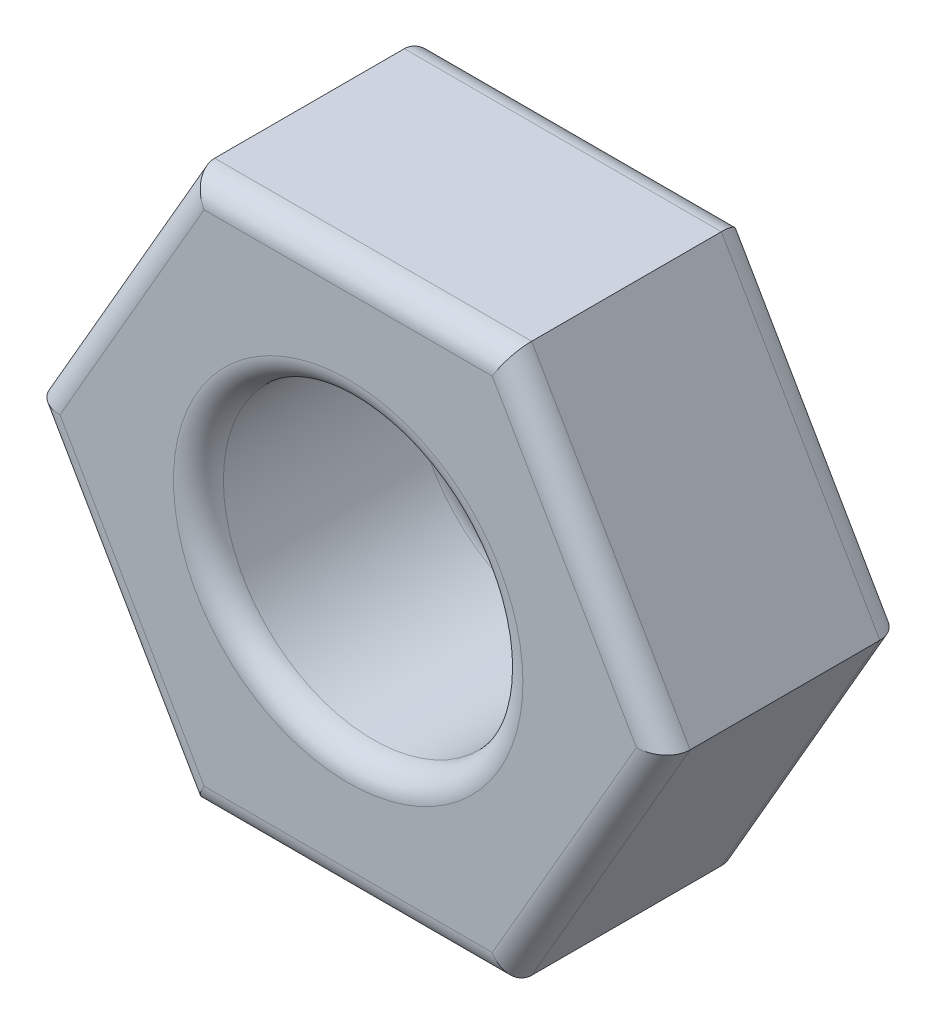
ISO-10303-21;
HEADER;
FILE_DESCRIPTION(('STEP AP214'),'2;1');
FILE_NAME('part.step','',(''),(''),'','','');
FILE_SCHEMA(('AUTOMOTIVE_DESIGN { 1 0 10303 214 1 1 1 1 }'));
ENDSEC;
DATA;
#1=APPLICATION_CONTEXT('core data for automotive mechanical design processes');
#2=APPLICATION_PROTOCOL_DEFINITION('international standard','automotive_design',2000,#1);
#3=PRODUCT_CONTEXT('',#1,'mechanical');
#4=PRODUCT('Part','Part','',(#3));
#5=PRODUCT_RELATED_PRODUCT_CATEGORY('part','',(#4));
#6=PRODUCT_DEFINITION_FORMATION('','',#4);
#7=PRODUCT_DEFINITION_CONTEXT('part definition',#1,'design');
#8=PRODUCT_DEFINITION('design','',#6,#7);
#9=PRODUCT_DEFINITION_SHAPE('','',#8);
#10=(LENGTH_UNIT() NAMED_UNIT(*) SI_UNIT(.MILLI.,.METRE.));
#11=(NAMED_UNIT(*) PLANE_ANGLE_UNIT() SI_UNIT($,.RADIAN.));
#12=(NAMED_UNIT(*) SI_UNIT($,.STERADIAN.) SOLID_ANGLE_UNIT());
#13=UNCERTAINTY_MEASURE_WITH_UNIT(LENGTH_MEASURE(1.E-05),#10,'distance_accuracy_value','');
#14=(GEOMETRIC_REPRESENTATION_CONTEXT(3) GLOBAL_UNCERTAINTY_ASSIGNED_CONTEXT((#13)) GLOBAL_UNIT_ASSIGNED_CONTEXT((#10,
#11,#12)) REPRESENTATION_CONTEXT('',''));
#15=CARTESIAN_POINT('',(0.,0.,0.));
#16=DIRECTION('',(0.,0.,1.));
#17=DIRECTION('',(1.,0.,0.));
#18=AXIS2_PLACEMENT_3D('',#15,#16,#17);
#19=CARTESIAN_POINT('',(0.,0.,2.4));
#20=DIRECTION('',(0.,0.,1.));
#21=DIRECTION('',(1.,0.,0.));
#22=AXIS2_PLACEMENT_3D('',#19,#20,#21);
#23=PLANE('',#22);
#24=CARTESIAN_POINT('',(0.,0.,2.4));
#25=DIRECTION('',(0.,0.,1.));
#26=DIRECTION('',(1.,0.,0.));
#27=AXIS2_PLACEMENT_3D('',#24,#25,#26);
#28=CIRCLE('',#27,1.75);
#29=CARTESIAN_POINT('',(1.75,0.,2.4));
#30=VERTEX_POINT('',#29);
#31=EDGE_CURVE('E11',#30,#30,#28,.F.);
#32=ORIENTED_EDGE('',*,*,#31,.T.);
#33=EDGE_LOOP('',(#32));
#34=FACE_BOUND('',#33,.T.);
#35=DIRECTION('',(1.,0.,0.));
#36=VECTOR('',#35,1.);
#37=CARTESIAN_POINT('',(1.58771324027147,-2.5,2.4));
#38=LINE('',#37,#36);
#39=CARTESIAN_POINT('',(-1.44337567297407,-2.5,2.4));
#40=VERTEX_POINT('',#39);
#41=CARTESIAN_POINT('',(1.44337567297406,-2.5,2.4));
#42=VERTEX_POINT('',#41);
#43=EDGE_CURVE('E58',#40,#42,#38,.T.);
#44=ORIENTED_EDGE('',*,*,#43,.T.);
#45=DIRECTION('',(0.5,0.866025403784439,0.));
#46=VECTOR('',#45,1.);
#47=CARTESIAN_POINT('',(2.95892012959683,0.125000000000001,2.4));
#48=LINE('',#47,#46);
#49=CARTESIAN_POINT('',(2.88675134594813,0.,2.4));
#50=VERTEX_POINT('',#49);
#51=EDGE_CURVE('E50',#42,#50,#48,.T.);
#52=ORIENTED_EDGE('',*,*,#51,.T.);
#53=DIRECTION('',(-0.5,0.866025403784439,0.));
#54=VECTOR('',#53,1.);
#55=CARTESIAN_POINT('',(1.37120688932536,2.625,2.4));
#56=LINE('',#55,#54);
#57=CARTESIAN_POINT('',(1.44337567297407,2.5,2.4));
#58=VERTEX_POINT('',#57);
#59=EDGE_CURVE('E197',#50,#58,#56,.T.);
#60=ORIENTED_EDGE('',*,*,#59,.T.);
#61=DIRECTION('',(-1.,0.,0.));
#62=VECTOR('',#61,1.);
#63=CARTESIAN_POINT('',(-1.58771324027147,2.5,2.4));
#64=LINE('',#63,#62);
#65=CARTESIAN_POINT('',(-1.44337567297406,2.5,2.4));
#66=VERTEX_POINT('',#65);
#67=EDGE_CURVE('E199',#58,#66,#64,.T.);
#68=ORIENTED_EDGE('',*,*,#67,.T.);
#69=DIRECTION('',(-0.5,-0.866025403784439,0.));
#70=VECTOR('',#69,1.);
#71=CARTESIAN_POINT('',(-2.95892012959683,-0.124999999999999,2.4));
#72=LINE('',#71,#70);
#73=CARTESIAN_POINT('',(-2.88675134594813,0.,2.4));
#74=VERTEX_POINT('',#73);
#75=EDGE_CURVE('E201',#66,#74,#72,.T.);
#76=ORIENTED_EDGE('',*,*,#75,.T.);
#77=DIRECTION('',(0.5,-0.866025403784439,0.));
#78=VECTOR('',#77,1.);
#79=CARTESIAN_POINT('',(-1.37120688932536,-2.625,2.4));
#80=LINE('',#79,#78);
#81=EDGE_CURVE('E63',#74,#40,#80,.T.);
#82=ORIENTED_EDGE('',*,*,#81,.T.);
#83=EDGE_LOOP('',(#44,#52,#60,#68,#76,#82));
#84=FACE_BOUND('',#83,.T.);
#85=ADVANCED_FACE('F41',(#34,#84),#23,.T.);
#86=CARTESIAN_POINT('',(0.,0.,0.));
#87=DIRECTION('',(0.,0.,1.));
#88=DIRECTION('',(1.,0.,0.));
#89=AXIS2_PLACEMENT_3D('',#86,#87,#88);
#90=PLANE('',#89);
#91=CARTESIAN_POINT('',(0.,0.,0.));
#92=DIRECTION('',(0.,0.,1.));
#93=DIRECTION('',(1.,0.,0.));
#94=AXIS2_PLACEMENT_3D('',#91,#92,#93);
#95=CIRCLE('',#94,1.75);
#96=CARTESIAN_POINT('',(1.75,0.,0.));
#97=VERTEX_POINT('',#96);
#98=EDGE_CURVE('E159',#97,#97,#95,.T.);
#99=ORIENTED_EDGE('',*,*,#98,.T.);
#100=EDGE_LOOP('',(#99));
#101=FACE_BOUND('',#100,.T.);
#102=DIRECTION('',(-0.5,-0.866025403784439,0.));
#103=VECTOR('',#102,1.);
#104=CARTESIAN_POINT('',(-2.1650635094611,1.25,0.));
#105=LINE('',#104,#103);
#106=CARTESIAN_POINT('',(-2.88675134594813,0.,0.));
#107=VERTEX_POINT('',#106);
#108=CARTESIAN_POINT('',(-1.44337567297406,2.5,0.));
#109=VERTEX_POINT('',#108);
#110=EDGE_CURVE('E158',#107,#109,#105,.F.);
#111=ORIENTED_EDGE('',*,*,#110,.T.);
#112=DIRECTION('',(-1.,0.,0.));
#113=VECTOR('',#112,1.);
#114=CARTESIAN_POINT('',(0.,2.5,0.));
#115=LINE('',#114,#113);
#116=CARTESIAN_POINT('',(1.44337567297406,2.5,0.));
#117=VERTEX_POINT('',#116);
#118=EDGE_CURVE('E137',#109,#117,#115,.F.);
#119=ORIENTED_EDGE('',*,*,#118,.T.);
#120=DIRECTION('',(-0.5,0.866025403784439,0.));
#121=VECTOR('',#120,1.);
#122=CARTESIAN_POINT('',(2.1650635094611,1.25,0.));
#123=LINE('',#122,#121);
#124=CARTESIAN_POINT('',(2.88675134594813,0.,0.));
#125=VERTEX_POINT('',#124);
#126=EDGE_CURVE('E147',#117,#125,#123,.F.);
#127=ORIENTED_EDGE('',*,*,#126,.T.);
#128=DIRECTION('',(0.5,0.866025403784439,0.));
#129=VECTOR('',#128,1.);
#130=CARTESIAN_POINT('',(2.1650635094611,-1.25,0.));
#131=LINE('',#130,#129);
#132=CARTESIAN_POINT('',(1.44337567297406,-2.5,0.));
#133=VERTEX_POINT('',#132);
#134=EDGE_CURVE('E153',#125,#133,#131,.F.);
#135=ORIENTED_EDGE('',*,*,#134,.T.);
#136=DIRECTION('',(1.,0.,0.));
#137=VECTOR('',#136,1.);
#138=CARTESIAN_POINT('',(0.,-2.5,0.));
#139=LINE('',#138,#137);
#140=CARTESIAN_POINT('',(-1.44337567297407,-2.5,0.));
#141=VERTEX_POINT('',#140);
#142=EDGE_CURVE('E259',#133,#141,#139,.F.);
#143=ORIENTED_EDGE('',*,*,#142,.T.);
#144=DIRECTION('',(0.5,-0.866025403784439,0.));
#145=VECTOR('',#144,1.);
#146=CARTESIAN_POINT('',(-2.1650635094611,-1.25,0.));
#147=LINE('',#146,#145);
#148=EDGE_CURVE('E164',#141,#107,#147,.F.);
#149=ORIENTED_EDGE('',*,*,#148,.T.);
#150=EDGE_LOOP('',(#111,#119,#127,#135,#143,#149));
#151=FACE_BOUND('',#150,.T.);
#152=ADVANCED_FACE('F156',(#101,#151),#90,.F.);
#153=CARTESIAN_POINT('',(3.17542648054294,0.,2.4));
#154=DIRECTION('',(-0.866025403784439,-0.5,0.));
#155=DIRECTION('',(0.5,-0.866025403784439,0.));
#156=AXIS2_PLACEMENT_3D('',#153,#154,#155);
#157=PLANE('',#156);
#158=DIRECTION('',(0.,0.,-1.));
#159=VECTOR('',#158,1.);
#160=CARTESIAN_POINT('',(3.17542648054294,0.,2.4));
#161=LINE('',#160,#159);
#162=CARTESIAN_POINT('',(3.17542648054294,0.,2.15));
#163=VERTEX_POINT('',#162);
#164=CARTESIAN_POINT('',(3.17542648054294,0.,0.25));
#165=VERTEX_POINT('',#164);
#166=EDGE_CURVE('E216',#163,#165,#161,.T.);
#167=ORIENTED_EDGE('',*,*,#166,.T.);
#168=DIRECTION('',(-0.5,0.866025403784439,0.));
#169=VECTOR('',#168,1.);
#170=CARTESIAN_POINT('',(3.17542648054294,0.,0.25));
#171=LINE('',#170,#169);
#172=CARTESIAN_POINT('',(1.58771324027147,2.75,0.25));
#173=VERTEX_POINT('',#172);
#174=EDGE_CURVE('E195',#165,#173,#171,.T.);
#175=ORIENTED_EDGE('',*,*,#174,.T.);
#176=DIRECTION('',(0.,0.,-1.));
#177=VECTOR('',#176,1.);
#178=CARTESIAN_POINT('',(1.58771324027147,2.75,2.4));
#179=LINE('',#178,#177);
#180=CARTESIAN_POINT('',(1.58771324027147,2.75,2.15));
#181=VERTEX_POINT('',#180);
#182=EDGE_CURVE('E154',#181,#173,#179,.T.);
#183=ORIENTED_EDGE('',*,*,#182,.F.);
#184=DIRECTION('',(-0.5,0.866025403784439,0.));
#185=VECTOR('',#184,1.);
#186=CARTESIAN_POINT('',(3.17542648054294,0.,2.15));
#187=LINE('',#186,#185);
#188=EDGE_CURVE('E193',#181,#163,#187,.F.);
#189=ORIENTED_EDGE('',*,*,#188,.T.);
#190=EDGE_LOOP('',(#167,#175,#183,#189));
#191=FACE_BOUND('',#190,.T.);
#192=ADVANCED_FACE('F283',(#191),#157,.F.);
#193=CARTESIAN_POINT('',(1.58771324027147,2.75,2.4));
#194=DIRECTION('',(0.,-1.,0.));
#195=DIRECTION('',(0.,0.,-1.));
#196=AXIS2_PLACEMENT_3D('',#193,#194,#195);
#197=PLANE('',#196);
#198=ORIENTED_EDGE('',*,*,#182,.T.);
#199=DIRECTION('',(-1.,0.,0.));
#200=VECTOR('',#199,1.);
#201=CARTESIAN_POINT('',(1.58771324027147,2.75,0.25));
#202=LINE('',#201,#200);
#203=CARTESIAN_POINT('',(-1.58771324027147,2.75,0.25));
#204=VERTEX_POINT('',#203);
#205=EDGE_CURVE('E140',#173,#204,#202,.T.);
#206=ORIENTED_EDGE('',*,*,#205,.T.);
#207=DIRECTION('',(0.,0.,-1.));
#208=VECTOR('',#207,1.);
#209=CARTESIAN_POINT('',(-1.58771324027147,2.75,2.4));
#210=LINE('',#209,#208);
#211=CARTESIAN_POINT('',(-1.58771324027147,2.75,2.15));
#212=VERTEX_POINT('',#211);
#213=EDGE_CURVE('E245',#212,#204,#210,.T.);
#214=ORIENTED_EDGE('',*,*,#213,.F.);
#215=DIRECTION('',(-1.,0.,0.));
#216=VECTOR('',#215,1.);
#217=CARTESIAN_POINT('',(1.58771324027147,2.75,2.15));
#218=LINE('',#217,#216);
#219=EDGE_CURVE('E173',#212,#181,#218,.F.);
#220=ORIENTED_EDGE('',*,*,#219,.T.);
#221=EDGE_LOOP('',(#198,#206,#214,#220));
#222=FACE_BOUND('',#221,.T.);
#223=ADVANCED_FACE('F250',(#222),#197,.F.);
#224=CARTESIAN_POINT('',(-1.58771324027147,2.75,2.4));
#225=DIRECTION('',(0.866025403784439,-0.5,0.));
#226=DIRECTION('',(0.5,0.866025403784439,0.));
#227=AXIS2_PLACEMENT_3D('',#224,#225,#226);
#228=PLANE('',#227);
#229=ORIENTED_EDGE('',*,*,#213,.T.);
#230=DIRECTION('',(-0.5,-0.866025403784439,0.));
#231=VECTOR('',#230,1.);
#232=CARTESIAN_POINT('',(-1.58771324027147,2.75,0.25));
#233=LINE('',#232,#231);
#234=CARTESIAN_POINT('',(-3.17542648054294,0.,0.25));
#235=VERTEX_POINT('',#234);
#236=EDGE_CURVE('E178',#204,#235,#233,.T.);
#237=ORIENTED_EDGE('',*,*,#236,.T.);
#238=DIRECTION('',(0.,0.,-1.));
#239=VECTOR('',#238,1.);
#240=CARTESIAN_POINT('',(-3.17542648054294,0.,2.4));
#241=LINE('',#240,#239);
#242=CARTESIAN_POINT('',(-3.17542648054294,0.,2.15));
#243=VERTEX_POINT('',#242);
#244=EDGE_CURVE('E247',#243,#235,#241,.T.);
#245=ORIENTED_EDGE('',*,*,#244,.F.);
#246=DIRECTION('',(-0.5,-0.866025403784439,0.));
#247=VECTOR('',#246,1.);
#248=CARTESIAN_POINT('',(-1.58771324027147,2.75,2.15));
#249=LINE('',#248,#247);
#250=EDGE_CURVE('E176',#243,#212,#249,.F.);
#251=ORIENTED_EDGE('',*,*,#250,.T.);
#252=EDGE_LOOP('',(#229,#237,#245,#251));
#253=FACE_BOUND('',#252,.T.);
#254=ADVANCED_FACE('F244',(#253),#228,.F.);
#255=CARTESIAN_POINT('',(-3.17542648054294,0.,2.4));
#256=DIRECTION('',(0.866025403784439,0.5,0.));
#257=DIRECTION('',(-0.5,0.866025403784439,0.));
#258=AXIS2_PLACEMENT_3D('',#255,#256,#257);
#259=PLANE('',#258);
#260=ORIENTED_EDGE('',*,*,#244,.T.);
#261=DIRECTION('',(0.5,-0.866025403784439,0.));
#262=VECTOR('',#261,1.);
#263=CARTESIAN_POINT('',(-3.17542648054294,0.,0.25));
#264=LINE('',#263,#262);
#265=CARTESIAN_POINT('',(-1.58771324027147,-2.75,0.25));
#266=VERTEX_POINT('',#265);
#267=EDGE_CURVE('E182',#235,#266,#264,.T.);
#268=ORIENTED_EDGE('',*,*,#267,.T.);
#269=DIRECTION('',(0.,0.,-1.));
#270=VECTOR('',#269,1.);
#271=CARTESIAN_POINT('',(-1.58771324027147,-2.75,2.4));
#272=LINE('',#271,#270);
#273=CARTESIAN_POINT('',(-1.58771324027147,-2.75,2.15));
#274=VERTEX_POINT('',#273);
#275=EDGE_CURVE('E254',#274,#266,#272,.T.);
#276=ORIENTED_EDGE('',*,*,#275,.F.);
#277=DIRECTION('',(0.5,-0.866025403784439,0.));
#278=VECTOR('',#277,1.);
#279=CARTESIAN_POINT('',(-3.17542648054294,0.,2.15));
#280=LINE('',#279,#278);
#281=EDGE_CURVE('E180',#274,#243,#280,.F.);
#282=ORIENTED_EDGE('',*,*,#281,.T.);
#283=EDGE_LOOP('',(#260,#268,#276,#282));
#284=FACE_BOUND('',#283,.T.);
#285=ADVANCED_FACE('F271',(#284),#259,.F.);
#286=CARTESIAN_POINT('',(-1.58771324027147,-2.75,2.4));
#287=DIRECTION('',(0.,1.,0.));
#288=DIRECTION('',(-1.,0.,0.));
#289=AXIS2_PLACEMENT_3D('',#286,#287,#288);
#290=PLANE('',#289);
#291=ORIENTED_EDGE('',*,*,#275,.T.);
#292=DIRECTION('',(1.,0.,0.));
#293=VECTOR('',#292,1.);
#294=CARTESIAN_POINT('',(-1.58771324027147,-2.75,0.25));
#295=LINE('',#294,#293);
#296=CARTESIAN_POINT('',(1.58771324027147,-2.75,0.25));
#297=VERTEX_POINT('',#296);
#298=EDGE_CURVE('E186',#266,#297,#295,.T.);
#299=ORIENTED_EDGE('',*,*,#298,.T.);
#300=DIRECTION('',(0.,0.,-1.));
#301=VECTOR('',#300,1.);
#302=CARTESIAN_POINT('',(1.58771324027147,-2.75,2.4));
#303=LINE('',#302,#301);
#304=CARTESIAN_POINT('',(1.58771324027147,-2.75,2.15));
#305=VERTEX_POINT('',#304);
#306=EDGE_CURVE('E276',#305,#297,#303,.T.);
#307=ORIENTED_EDGE('',*,*,#306,.F.);
#308=DIRECTION('',(1.,0.,0.));
#309=VECTOR('',#308,1.);
#310=CARTESIAN_POINT('',(-1.58771324027147,-2.75,2.15));
#311=LINE('',#310,#309);
#312=EDGE_CURVE('E184',#305,#274,#311,.F.);
#313=ORIENTED_EDGE('',*,*,#312,.T.);
#314=EDGE_LOOP('',(#291,#299,#307,#313));
#315=FACE_BOUND('',#314,.T.);
#316=ADVANCED_FACE('F294',(#315),#290,.F.);
#317=CARTESIAN_POINT('',(1.58771324027147,-2.75,2.4));
#318=DIRECTION('',(-0.866025403784438,0.5,0.));
#319=DIRECTION('',(-0.5,-0.866025403784439,0.));
#320=AXIS2_PLACEMENT_3D('',#317,#318,#319);
#321=PLANE('',#320);
#322=ORIENTED_EDGE('',*,*,#306,.T.);
#323=DIRECTION('',(0.5,0.866025403784439,0.));
#324=VECTOR('',#323,1.);
#325=CARTESIAN_POINT('',(1.58771324027147,-2.75,0.25));
#326=LINE('',#325,#324);
#327=EDGE_CURVE('E191',#297,#165,#326,.T.);
#328=ORIENTED_EDGE('',*,*,#327,.T.);
#329=ORIENTED_EDGE('',*,*,#166,.F.);
#330=DIRECTION('',(0.5,0.866025403784439,0.));
#331=VECTOR('',#330,1.);
#332=CARTESIAN_POINT('',(1.58771324027147,-2.75,2.15));
#333=LINE('',#332,#331);
#334=EDGE_CURVE('E188',#163,#305,#333,.F.);
#335=ORIENTED_EDGE('',*,*,#334,.T.);
#336=EDGE_LOOP('',(#322,#328,#329,#335));
#337=FACE_BOUND('',#336,.T.);
#338=ADVANCED_FACE('F295',(#337),#321,.F.);
#339=CARTESIAN_POINT('',(0.,0.,2.4));
#340=DIRECTION('',(0.,0.,-1.));
#341=DIRECTION('',(-1.,0.,0.));
#342=AXIS2_PLACEMENT_3D('',#339,#340,#341);
#343=CYLINDRICAL_SURFACE('',#342,1.5);
#344=CARTESIAN_POINT('',(0.,0.,0.25));
#345=DIRECTION('',(0.,0.,1.));
#346=DIRECTION('',(1.,0.,0.));
#347=AXIS2_PLACEMENT_3D('',#344,#345,#346);
#348=CIRCLE('',#347,1.5);
#349=CARTESIAN_POINT('',(1.5,0.,0.25));
#350=VERTEX_POINT('',#349);
#351=EDGE_CURVE('E170',#350,#350,#348,.F.);
#352=ORIENTED_EDGE('',*,*,#351,.T.);
#353=EDGE_LOOP('',(#352));
#354=FACE_BOUND('',#353,.T.);
#355=CARTESIAN_POINT('',(0.,0.,2.15));
#356=DIRECTION('',(0.,0.,1.));
#357=DIRECTION('',(1.,0.,0.));
#358=AXIS2_PLACEMENT_3D('',#355,#356,#357);
#359=CIRCLE('',#358,1.5);
#360=CARTESIAN_POINT('',(1.5,0.,2.15));
#361=VERTEX_POINT('',#360);
#362=EDGE_CURVE('E162',#361,#361,#359,.T.);
#363=ORIENTED_EDGE('',*,*,#362,.T.);
#364=EDGE_LOOP('',(#363));
#365=FACE_BOUND('',#364,.T.);
#366=ADVANCED_FACE('F314',(#354,#365),#343,.F.);
#367=CARTESIAN_POINT('',(0.,0.,0.25));
#368=DIRECTION('',(0.,0.,1.));
#369=DIRECTION('',(1.,0.,0.));
#370=AXIS2_PLACEMENT_3D('',#367,#368,#369);
#371=TOROIDAL_SURFACE('',#370,1.75,0.25);
#372=ORIENTED_EDGE('',*,*,#351,.F.);
#373=EDGE_LOOP('',(#372));
#374=FACE_BOUND('',#373,.T.);
#375=ORIENTED_EDGE('',*,*,#98,.F.);
#376=EDGE_LOOP('',(#375));
#377=FACE_BOUND('',#376,.T.);
#378=ADVANCED_FACE('F328',(#374,#377),#371,.T.);
#379=CARTESIAN_POINT('',(-1.58771324027147,-2.5,0.25));
#380=DIRECTION('',(1.,0.,0.));
#381=DIRECTION('',(0.,1.,0.));
#382=AXIS2_PLACEMENT_3D('',#379,#380,#381);
#383=CYLINDRICAL_SURFACE('',#382,0.25);
#384=CARTESIAN_POINT('',(-1.44337567297407,-2.5,0.25));
#385=DIRECTION('',(0.866025403784439,-0.5,0.));
#386=DIRECTION('',(0.5,0.866025403784439,0.));
#387=AXIS2_PLACEMENT_3D('',#384,#385,#386);
#388=ELLIPSE('',#387,0.288675134594813,0.25);
#389=EDGE_CURVE('E210',#141,#266,#388,.F.);
#390=ORIENTED_EDGE('',*,*,#389,.F.);
#391=ORIENTED_EDGE('',*,*,#142,.F.);
#392=CARTESIAN_POINT('',(1.44337567297406,-2.5,0.25));
#393=DIRECTION('',(0.866025403784439,0.5,0.));
#394=DIRECTION('',(-0.5,0.866025403784439,0.));
#395=AXIS2_PLACEMENT_3D('',#392,#393,#394);
#396=ELLIPSE('',#395,0.288675134594813,0.25);
#397=EDGE_CURVE('E213',#297,#133,#396,.T.);
#398=ORIENTED_EDGE('',*,*,#397,.F.);
#399=ORIENTED_EDGE('',*,*,#298,.F.);
#400=EDGE_LOOP('',(#390,#391,#398,#399));
#401=FACE_BOUND('',#400,.T.);
#402=ADVANCED_FACE('F292',(#401),#383,.T.);
#403=CARTESIAN_POINT('',(1.37120688932536,-2.625,0.25));
#404=DIRECTION('',(0.5,0.866025403784439,0.));
#405=DIRECTION('',(-0.866025403784439,0.5,0.));
#406=AXIS2_PLACEMENT_3D('',#403,#404,#405);
#407=CYLINDRICAL_SURFACE('',#406,0.25);
#408=ORIENTED_EDGE('',*,*,#397,.T.);
#409=ORIENTED_EDGE('',*,*,#134,.F.);
#410=CARTESIAN_POINT('',(2.88675134594813,0.,0.25));
#411=DIRECTION('',(0.,1.,0.));
#412=DIRECTION('',(-1.,0.,0.));
#413=AXIS2_PLACEMENT_3D('',#410,#411,#412);
#414=ELLIPSE('',#413,0.288675134594813,0.25);
#415=EDGE_CURVE('E150',#165,#125,#414,.T.);
#416=ORIENTED_EDGE('',*,*,#415,.F.);
#417=ORIENTED_EDGE('',*,*,#327,.F.);
#418=EDGE_LOOP('',(#408,#409,#416,#417));
#419=FACE_BOUND('',#418,.T.);
#420=ADVANCED_FACE('F289',(#419),#407,.T.);
#421=CARTESIAN_POINT('',(-2.95892012959683,0.125000000000001,0.25));
#422=DIRECTION('',(0.5,-0.866025403784439,0.));
#423=DIRECTION('',(0.866025403784439,0.5,0.));
#424=AXIS2_PLACEMENT_3D('',#421,#422,#423);
#425=CYLINDRICAL_SURFACE('',#424,0.25);
#426=ORIENTED_EDGE('',*,*,#389,.T.);
#427=ORIENTED_EDGE('',*,*,#267,.F.);
#428=CARTESIAN_POINT('',(-2.88675134594813,0.,0.25));
#429=DIRECTION('',(0.,-1.,0.));
#430=DIRECTION('',(1.,0.,0.));
#431=AXIS2_PLACEMENT_3D('',#428,#429,#430);
#432=ELLIPSE('',#431,0.288675134594813,0.25);
#433=EDGE_CURVE('E143',#107,#235,#432,.F.);
#434=ORIENTED_EDGE('',*,*,#433,.F.);
#435=ORIENTED_EDGE('',*,*,#148,.F.);
#436=EDGE_LOOP('',(#426,#427,#434,#435));
#437=FACE_BOUND('',#436,.T.);
#438=ADVANCED_FACE('F266',(#437),#425,.T.);
#439=CARTESIAN_POINT('',(2.95892012959683,-0.124999999999999,0.25));
#440=DIRECTION('',(-0.5,0.866025403784439,0.));
#441=DIRECTION('',(-0.866025403784439,-0.5,0.));
#442=AXIS2_PLACEMENT_3D('',#439,#440,#441);
#443=CYLINDRICAL_SURFACE('',#442,0.25);
#444=ORIENTED_EDGE('',*,*,#415,.T.);
#445=ORIENTED_EDGE('',*,*,#126,.F.);
#446=CARTESIAN_POINT('',(1.44337567297407,2.5,0.25));
#447=DIRECTION('',(-0.866025403784439,0.5,0.));
#448=DIRECTION('',(0.5,0.866025403784439,0.));
#449=AXIS2_PLACEMENT_3D('',#446,#447,#448);
#450=ELLIPSE('',#449,0.288675134594813,0.25);
#451=EDGE_CURVE('E133',#173,#117,#450,.T.);
#452=ORIENTED_EDGE('',*,*,#451,.F.);
#453=ORIENTED_EDGE('',*,*,#174,.F.);
#454=EDGE_LOOP('',(#444,#445,#452,#453));
#455=FACE_BOUND('',#454,.T.);
#456=ADVANCED_FACE('F148',(#455),#443,.T.);
#457=CARTESIAN_POINT('',(-1.37120688932536,2.625,0.25));
#458=DIRECTION('',(-0.5,-0.866025403784439,0.));
#459=DIRECTION('',(0.866025403784439,-0.5,0.));
#460=AXIS2_PLACEMENT_3D('',#457,#458,#459);
#461=CYLINDRICAL_SURFACE('',#460,0.25);
#462=ORIENTED_EDGE('',*,*,#433,.T.);
#463=ORIENTED_EDGE('',*,*,#236,.F.);
#464=CARTESIAN_POINT('',(-1.44337567297406,2.5,0.25));
#465=DIRECTION('',(-0.866025403784439,-0.5,0.));
#466=DIRECTION('',(0.5,-0.866025403784439,0.));
#467=AXIS2_PLACEMENT_3D('',#464,#465,#466);
#468=ELLIPSE('',#467,0.288675134594813,0.25);
#469=EDGE_CURVE('E144',#109,#204,#468,.F.);
#470=ORIENTED_EDGE('',*,*,#469,.F.);
#471=ORIENTED_EDGE('',*,*,#110,.F.);
#472=EDGE_LOOP('',(#462,#463,#470,#471));
#473=FACE_BOUND('',#472,.T.);
#474=ADVANCED_FACE('F269',(#473),#461,.T.);
#475=CARTESIAN_POINT('',(1.58771324027147,2.5,0.25));
#476=DIRECTION('',(-1.,0.,0.));
#477=DIRECTION('',(0.,0.,1.));
#478=AXIS2_PLACEMENT_3D('',#475,#476,#477);
#479=CYLINDRICAL_SURFACE('',#478,0.25);
#480=ORIENTED_EDGE('',*,*,#451,.T.);
#481=ORIENTED_EDGE('',*,*,#118,.F.);
#482=ORIENTED_EDGE('',*,*,#469,.T.);
#483=ORIENTED_EDGE('',*,*,#205,.F.);
#484=EDGE_LOOP('',(#480,#481,#482,#483));
#485=FACE_BOUND('',#484,.T.);
#486=ADVANCED_FACE('F135',(#485),#479,.T.);
#487=CARTESIAN_POINT('',(0.,0.,2.15));
#488=DIRECTION('',(0.,0.,1.));
#489=DIRECTION('',(1.,0.,0.));
#490=AXIS2_PLACEMENT_3D('',#487,#488,#489);
#491=TOROIDAL_SURFACE('',#490,1.75,0.25);
#492=ORIENTED_EDGE('',*,*,#31,.F.);
#493=EDGE_LOOP('',(#492));
#494=FACE_BOUND('',#493,.T.);
#495=ORIENTED_EDGE('',*,*,#362,.F.);
#496=EDGE_LOOP('',(#495));
#497=FACE_BOUND('',#496,.T.);
#498=ADVANCED_FACE('F334',(#494,#497),#491,.T.);
#499=CARTESIAN_POINT('',(-2.1650635094611,1.25,2.15));
#500=DIRECTION('',(0.5,0.866025403784439,0.));
#501=DIRECTION('',(-0.866025403784439,0.5,0.));
#502=AXIS2_PLACEMENT_3D('',#499,#500,#501);
#503=CYLINDRICAL_SURFACE('',#502,0.25);
#504=CARTESIAN_POINT('',(-1.44337567297406,2.5,2.15));
#505=DIRECTION('',(0.866025403784439,0.5,0.));
#506=DIRECTION('',(0.5,-0.866025403784439,0.));
#507=AXIS2_PLACEMENT_3D('',#504,#505,#506);
#508=ELLIPSE('',#507,0.288675134594813,0.25);
#509=EDGE_CURVE('E226',#212,#66,#508,.T.);
#510=ORIENTED_EDGE('',*,*,#509,.F.);
#511=ORIENTED_EDGE('',*,*,#250,.F.);
#512=CARTESIAN_POINT('',(-2.88675134594813,0.,2.15));
#513=DIRECTION('',(0.,1.,0.));
#514=DIRECTION('',(1.,0.,0.));
#515=AXIS2_PLACEMENT_3D('',#512,#513,#514);
#516=ELLIPSE('',#515,0.288675134594813,0.25);
#517=EDGE_CURVE('E45',#74,#243,#516,.F.);
#518=ORIENTED_EDGE('',*,*,#517,.F.);
#519=ORIENTED_EDGE('',*,*,#75,.F.);
#520=EDGE_LOOP('',(#510,#511,#518,#519));
#521=FACE_BOUND('',#520,.T.);
#522=ADVANCED_FACE('F43',(#521),#503,.T.);
#523=CARTESIAN_POINT('',(-2.1650635094611,-1.25,2.15));
#524=DIRECTION('',(-0.5,0.866025403784439,0.));
#525=DIRECTION('',(-0.866025403784439,-0.5,0.));
#526=AXIS2_PLACEMENT_3D('',#523,#524,#525);
#527=CYLINDRICAL_SURFACE('',#526,0.25);
#528=ORIENTED_EDGE('',*,*,#517,.T.);
#529=ORIENTED_EDGE('',*,*,#281,.F.);
#530=CARTESIAN_POINT('',(-1.44337567297407,-2.5,2.15));
#531=DIRECTION('',(-0.866025403784439,0.5,0.));
#532=DIRECTION('',(0.5,0.866025403784439,0.));
#533=AXIS2_PLACEMENT_3D('',#530,#531,#532);
#534=ELLIPSE('',#533,0.288675134594813,0.25);
#535=EDGE_CURVE('E224',#40,#274,#534,.F.);
#536=ORIENTED_EDGE('',*,*,#535,.F.);
#537=ORIENTED_EDGE('',*,*,#81,.F.);
#538=EDGE_LOOP('',(#528,#529,#536,#537));
#539=FACE_BOUND('',#538,.T.);
#540=ADVANCED_FACE('F236',(#539),#527,.T.);
#541=CARTESIAN_POINT('',(0.,2.5,2.15));
#542=DIRECTION('',(1.,0.,0.));
#543=DIRECTION('',(0.,0.,-1.));
#544=AXIS2_PLACEMENT_3D('',#541,#542,#543);
#545=CYLINDRICAL_SURFACE('',#544,0.25);
#546=ORIENTED_EDGE('',*,*,#509,.T.);
#547=ORIENTED_EDGE('',*,*,#67,.F.);
#548=CARTESIAN_POINT('',(1.44337567297407,2.5,2.15));
#549=DIRECTION('',(0.866025403784439,-0.5,0.));
#550=DIRECTION('',(-0.5,-0.866025403784439,0.));
#551=AXIS2_PLACEMENT_3D('',#548,#549,#550);
#552=ELLIPSE('',#551,0.288675134594813,0.25);
#553=EDGE_CURVE('E221',#181,#58,#552,.T.);
#554=ORIENTED_EDGE('',*,*,#553,.F.);
#555=ORIENTED_EDGE('',*,*,#219,.F.);
#556=EDGE_LOOP('',(#546,#547,#554,#555));
#557=FACE_BOUND('',#556,.T.);
#558=ADVANCED_FACE('F355',(#557),#545,.T.);
#559=CARTESIAN_POINT('',(0.,-2.5,2.15));
#560=DIRECTION('',(-1.,0.,0.));
#561=DIRECTION('',(0.,-1.,0.));
#562=AXIS2_PLACEMENT_3D('',#559,#560,#561);
#563=CYLINDRICAL_SURFACE('',#562,0.25);
#564=ORIENTED_EDGE('',*,*,#535,.T.);
#565=ORIENTED_EDGE('',*,*,#312,.F.);
#566=CARTESIAN_POINT('',(1.44337567297406,-2.5,2.15));
#567=DIRECTION('',(-0.866025403784439,-0.5,0.));
#568=DIRECTION('',(-0.5,0.866025403784439,0.));
#569=AXIS2_PLACEMENT_3D('',#566,#567,#568);
#570=ELLIPSE('',#569,0.288675134594813,0.25);
#571=EDGE_CURVE('E219',#42,#305,#570,.F.);
#572=ORIENTED_EDGE('',*,*,#571,.F.);
#573=ORIENTED_EDGE('',*,*,#43,.F.);
#574=EDGE_LOOP('',(#564,#565,#572,#573));
#575=FACE_BOUND('',#574,.T.);
#576=ADVANCED_FACE('F352',(#575),#563,.T.);
#577=CARTESIAN_POINT('',(2.1650635094611,1.25,2.15));
#578=DIRECTION('',(0.5,-0.866025403784439,0.));
#579=DIRECTION('',(0.866025403784439,0.5,0.));
#580=AXIS2_PLACEMENT_3D('',#577,#578,#579);
#581=CYLINDRICAL_SURFACE('',#580,0.25);
#582=ORIENTED_EDGE('',*,*,#553,.T.);
#583=ORIENTED_EDGE('',*,*,#59,.F.);
#584=CARTESIAN_POINT('',(2.88675134594813,0.,2.15));
#585=DIRECTION('',(0.,-1.,0.));
#586=DIRECTION('',(1.,0.,0.));
#587=AXIS2_PLACEMENT_3D('',#584,#585,#586);
#588=ELLIPSE('',#587,0.288675134594813,0.25);
#589=EDGE_CURVE('E217',#163,#50,#588,.T.);
#590=ORIENTED_EDGE('',*,*,#589,.F.);
#591=ORIENTED_EDGE('',*,*,#188,.F.);
#592=EDGE_LOOP('',(#582,#583,#590,#591));
#593=FACE_BOUND('',#592,.T.);
#594=ADVANCED_FACE('F303',(#593),#581,.T.);
#595=CARTESIAN_POINT('',(2.1650635094611,-1.25,2.15));
#596=DIRECTION('',(-0.5,-0.866025403784439,0.));
#597=DIRECTION('',(0.866025403784439,-0.5,0.));
#598=AXIS2_PLACEMENT_3D('',#595,#596,#597);
#599=CYLINDRICAL_SURFACE('',#598,0.25);
#600=ORIENTED_EDGE('',*,*,#571,.T.);
#601=ORIENTED_EDGE('',*,*,#334,.F.);
#602=ORIENTED_EDGE('',*,*,#589,.T.);
#603=ORIENTED_EDGE('',*,*,#51,.F.);
#604=EDGE_LOOP('',(#600,#601,#602,#603));
#605=FACE_BOUND('',#604,.T.);
#606=ADVANCED_FACE('F298',(#605),#599,.T.);
#607=CLOSED_SHELL('',(#85,#152,#192,#223,#254,#285,#316,#338,#366,#378,#402,#420,#438,#456,#474,
#486,#498,#522,#540,#558,#576,#594,#606));
#608=MANIFOLD_SOLID_BREP('B2',#607);
#609=ADVANCED_BREP_SHAPE_REPRESENTATION('',(#18,#608),#14);
#610=SHAPE_DEFINITION_REPRESENTATION(#9,#609);
ENDSEC;
END-ISO-10303-21;
